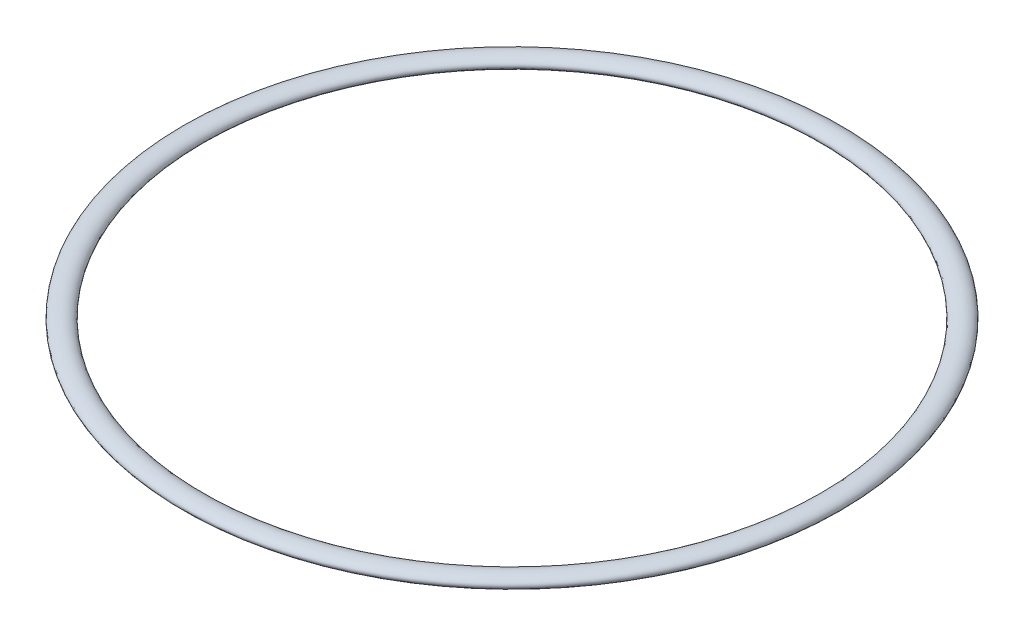
ISO-10303-21;
HEADER;
FILE_DESCRIPTION(('STEP AP214'),'2;1');
FILE_NAME('part.step','',(''),(''),'','','');
FILE_SCHEMA(('AUTOMOTIVE_DESIGN { 1 0 10303 214 1 1 1 1 }'));
ENDSEC;
DATA;
#1=APPLICATION_CONTEXT('core data for automotive mechanical design processes');
#2=APPLICATION_PROTOCOL_DEFINITION('international standard','automotive_design',2000,#1);
#3=PRODUCT_CONTEXT('',#1,'mechanical');
#4=PRODUCT('Part','Part','',(#3));
#5=PRODUCT_RELATED_PRODUCT_CATEGORY('part','',(#4));
#6=PRODUCT_DEFINITION_FORMATION('','',#4);
#7=PRODUCT_DEFINITION_CONTEXT('part definition',#1,'design');
#8=PRODUCT_DEFINITION('design','',#6,#7);
#9=PRODUCT_DEFINITION_SHAPE('','',#8);
#10=(LENGTH_UNIT() NAMED_UNIT(*) SI_UNIT(.MILLI.,.METRE.));
#11=(NAMED_UNIT(*) PLANE_ANGLE_UNIT() SI_UNIT($,.RADIAN.));
#12=(NAMED_UNIT(*) SI_UNIT($,.STERADIAN.) SOLID_ANGLE_UNIT());
#13=UNCERTAINTY_MEASURE_WITH_UNIT(LENGTH_MEASURE(1.E-05),#10,'distance_accuracy_value','');
#14=(GEOMETRIC_REPRESENTATION_CONTEXT(3) GLOBAL_UNCERTAINTY_ASSIGNED_CONTEXT((#13)) GLOBAL_UNIT_ASSIGNED_CONTEXT((#10,
#11,#12)) REPRESENTATION_CONTEXT('',''));
#15=CARTESIAN_POINT('',(0.,0.,0.));
#16=DIRECTION('',(0.,0.,1.));
#17=DIRECTION('',(1.,0.,0.));
#18=AXIS2_PLACEMENT_3D('',#15,#16,#17);
#19=CARTESIAN_POINT('',(39.425,0.,0.));
#20=DIRECTION('',(0.,0.,1.));
#21=DIRECTION('',(1.,0.,0.));
#22=AXIS2_PLACEMENT_3D('',#19,#20,#21);
#23=ELLIPSE('',#22,1.36444143178886,0.725);
#24=CARTESIAN_POINT('',(0.,-500.,0.));
#25=DIRECTION('',(0.,-1.,0.));
#26=AXIS1_PLACEMENT('',#24,#25);
#27=SURFACE_OF_REVOLUTION('',#23,#26);
#28=ADVANCED_FACE('F34',(),#27,.F.);
#29=CLOSED_SHELL('',(#28));
#30=MANIFOLD_SOLID_BREP('B2',#29);
#31=ADVANCED_BREP_SHAPE_REPRESENTATION('',(#18,#30),#14);
#32=SHAPE_DEFINITION_REPRESENTATION(#9,#31);
ENDSEC;
END-ISO-10303-21;
